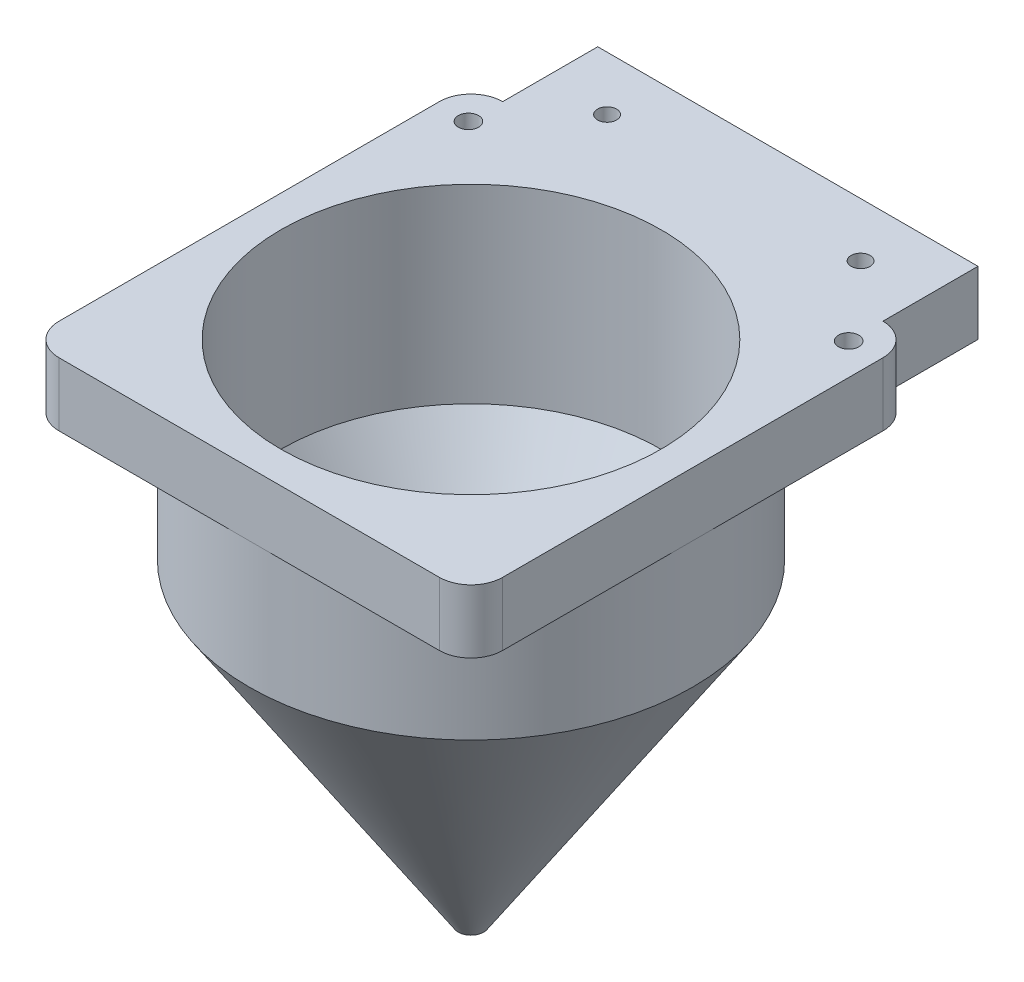
ISO-10303-21;
HEADER;
FILE_DESCRIPTION(('STEP AP214'),'2;1');
FILE_NAME('part.step','',(''),(''),'','','');
FILE_SCHEMA(('AUTOMOTIVE_DESIGN { 1 0 10303 214 1 1 1 1 }'));
ENDSEC;
DATA;
#1=APPLICATION_CONTEXT('core data for automotive mechanical design processes');
#2=APPLICATION_PROTOCOL_DEFINITION('international standard','automotive_design',2000,#1);
#3=PRODUCT_CONTEXT('',#1,'mechanical');
#4=PRODUCT('Part','Part','',(#3));
#5=PRODUCT_RELATED_PRODUCT_CATEGORY('part','',(#4));
#6=PRODUCT_DEFINITION_FORMATION('','',#4);
#7=PRODUCT_DEFINITION_CONTEXT('part definition',#1,'design');
#8=PRODUCT_DEFINITION('design','',#6,#7);
#9=PRODUCT_DEFINITION_SHAPE('','',#8);
#10=(LENGTH_UNIT() NAMED_UNIT(*) SI_UNIT(.MILLI.,.METRE.));
#11=(NAMED_UNIT(*) PLANE_ANGLE_UNIT() SI_UNIT($,.RADIAN.));
#12=(NAMED_UNIT(*) SI_UNIT($,.STERADIAN.) SOLID_ANGLE_UNIT());
#13=UNCERTAINTY_MEASURE_WITH_UNIT(LENGTH_MEASURE(1.E-05),#10,'distance_accuracy_value','');
#14=(GEOMETRIC_REPRESENTATION_CONTEXT(3) GLOBAL_UNCERTAINTY_ASSIGNED_CONTEXT((#13)) GLOBAL_UNIT_ASSIGNED_CONTEXT((#10,
#11,#12)) REPRESENTATION_CONTEXT('',''));
#15=CARTESIAN_POINT('',(0.,0.,0.));
#16=DIRECTION('',(0.,0.,1.));
#17=DIRECTION('',(1.,0.,0.));
#18=AXIS2_PLACEMENT_3D('',#15,#16,#17);
#19=CARTESIAN_POINT('',(35.,0.,0.));
#20=DIRECTION('',(1.,0.,0.));
#21=DIRECTION('',(0.,0.,-1.));
#22=AXIS2_PLACEMENT_3D('',#19,#20,#21);
#23=PLANE('',#22);
#24=DIRECTION('',(0.,0.,1.));
#25=VECTOR('',#24,1.);
#26=CARTESIAN_POINT('',(35.,30.,35.));
#27=LINE('',#26,#25);
#28=CARTESIAN_POINT('',(35.,30.,-30.));
#29=VERTEX_POINT('',#28);
#30=CARTESIAN_POINT('',(35.,30.,30.));
#31=VERTEX_POINT('',#30);
#32=EDGE_CURVE('E192',#29,#31,#27,.T.);
#33=ORIENTED_EDGE('',*,*,#32,.T.);
#34=DIRECTION('',(0.,-1.,0.));
#35=VECTOR('',#34,1.);
#36=CARTESIAN_POINT('',(35.,0.,30.));
#37=LINE('',#36,#35);
#38=CARTESIAN_POINT('',(35.,20.,30.));
#39=VERTEX_POINT('',#38);
#40=EDGE_CURVE('E235',#31,#39,#37,.T.);
#41=ORIENTED_EDGE('',*,*,#40,.T.);
#42=DIRECTION('',(0.,0.,-1.));
#43=VECTOR('',#42,1.);
#44=CARTESIAN_POINT('',(35.,20.,35.));
#45=LINE('',#44,#43);
#46=CARTESIAN_POINT('',(35.,20.,0.));
#47=VERTEX_POINT('',#46);
#48=EDGE_CURVE('E177',#39,#47,#45,.T.);
#49=ORIENTED_EDGE('',*,*,#48,.T.);
#50=DIRECTION('',(0.,0.,-1.));
#51=VECTOR('',#50,1.);
#52=CARTESIAN_POINT('',(35.,20.,35.));
#53=LINE('',#52,#51);
#54=CARTESIAN_POINT('',(35.,20.,-30.));
#55=VERTEX_POINT('',#54);
#56=EDGE_CURVE('E187',#47,#55,#53,.T.);
#57=ORIENTED_EDGE('',*,*,#56,.T.);
#58=DIRECTION('',(0.,1.,0.));
#59=VECTOR('',#58,1.);
#60=CARTESIAN_POINT('',(35.,0.,-30.));
#61=LINE('',#60,#59);
#62=EDGE_CURVE('E231',#55,#29,#61,.T.);
#63=ORIENTED_EDGE('',*,*,#62,.T.);
#64=EDGE_LOOP('',(#33,#41,#49,#57,#63));
#65=FACE_BOUND('',#64,.T.);
#66=ADVANCED_FACE('F45',(#65),#23,.T.);
#67=CARTESIAN_POINT('',(-35.001,20.,35.));
#68=DIRECTION('',(0.,-1.,0.));
#69=DIRECTION('',(0.,0.,-1.));
#70=AXIS2_PLACEMENT_3D('',#67,#68,#69);
#71=PLANE('',#70);
#72=CARTESIAN_POINT('',(-20.,20.,-41.4717846910839));
#73=DIRECTION('',(0.,-1.,0.));
#74=DIRECTION('',(0.,0.,-1.));
#75=AXIS2_PLACEMENT_3D('',#72,#73,#74);
#76=CIRCLE('',#75,1.5);
#77=CARTESIAN_POINT('',(-20.,20.,-42.9717846910839));
#78=VERTEX_POINT('',#77);
#79=EDGE_CURVE('E142',#78,#78,#76,.T.);
#80=ORIENTED_EDGE('',*,*,#79,.F.);
#81=EDGE_LOOP('',(#80));
#82=FACE_BOUND('',#81,.T.);
#83=CARTESIAN_POINT('',(20.,20.,-41.4717846910839));
#84=DIRECTION('',(0.,-1.,0.));
#85=DIRECTION('',(0.,0.,-1.));
#86=AXIS2_PLACEMENT_3D('',#83,#84,#85);
#87=CIRCLE('',#86,1.5);
#88=CARTESIAN_POINT('',(20.,20.,-42.9717846910839));
#89=VERTEX_POINT('',#88);
#90=EDGE_CURVE('E333',#89,#89,#87,.T.);
#91=ORIENTED_EDGE('',*,*,#90,.F.);
#92=EDGE_LOOP('',(#91));
#93=FACE_BOUND('',#92,.T.);
#94=CARTESIAN_POINT('',(30.,20.,-29.5959027597665));
#95=DIRECTION('',(0.,-1.,0.));
#96=DIRECTION('',(0.,0.,-1.));
#97=AXIS2_PLACEMENT_3D('',#94,#95,#96);
#98=CIRCLE('',#97,1.6);
#99=CARTESIAN_POINT('',(30.,20.,-31.1959027597665));
#100=VERTEX_POINT('',#99);
#101=EDGE_CURVE('E172',#100,#100,#98,.T.);
#102=ORIENTED_EDGE('',*,*,#101,.F.);
#103=EDGE_LOOP('',(#102));
#104=FACE_BOUND('',#103,.T.);
#105=CARTESIAN_POINT('',(0.,20.,0.));
#106=DIRECTION('',(0.,-1.,0.));
#107=DIRECTION('',(0.,0.,-1.));
#108=AXIS2_PLACEMENT_3D('',#105,#106,#107);
#109=CIRCLE('',#108,35.);
#110=CARTESIAN_POINT('',(-35.,20.,0.));
#111=VERTEX_POINT('',#110);
#112=EDGE_CURVE('E188',#47,#111,#109,.F.);
#113=ORIENTED_EDGE('',*,*,#112,.T.);
#114=DIRECTION('',(0.,0.,-1.));
#115=VECTOR('',#114,1.);
#116=CARTESIAN_POINT('',(-35.,20.,35.));
#117=LINE('',#116,#115);
#118=CARTESIAN_POINT('',(-35.,20.,-30.));
#119=VERTEX_POINT('',#118);
#120=EDGE_CURVE('E137',#111,#119,#117,.T.);
#121=ORIENTED_EDGE('',*,*,#120,.T.);
#122=CARTESIAN_POINT('',(-30.,20.,-30.));
#123=DIRECTION('',(0.,1.,0.));
#124=DIRECTION('',(0.,0.,1.));
#125=AXIS2_PLACEMENT_3D('',#122,#123,#124);
#126=CIRCLE('',#125,5.);
#127=CARTESIAN_POINT('',(-30.,20.,-35.));
#128=VERTEX_POINT('',#127);
#129=EDGE_CURVE('E129',#119,#128,#126,.F.);
#130=ORIENTED_EDGE('',*,*,#129,.T.);
#131=DIRECTION('',(0.,0.,1.));
#132=VECTOR('',#131,1.);
#133=CARTESIAN_POINT('',(-30.,20.,-50.));
#134=LINE('',#133,#132);
#135=CARTESIAN_POINT('',(-30.,20.,-50.));
#136=VERTEX_POINT('',#135);
#137=EDGE_CURVE('E134',#136,#128,#134,.T.);
#138=ORIENTED_EDGE('',*,*,#137,.F.);
#139=DIRECTION('',(-1.,0.,0.));
#140=VECTOR('',#139,1.);
#141=CARTESIAN_POINT('',(30.,20.,-50.));
#142=LINE('',#141,#140);
#143=CARTESIAN_POINT('',(30.,20.,-50.));
#144=VERTEX_POINT('',#143);
#145=EDGE_CURVE('E303',#144,#136,#142,.T.);
#146=ORIENTED_EDGE('',*,*,#145,.F.);
#147=DIRECTION('',(0.,0.,1.));
#148=VECTOR('',#147,1.);
#149=CARTESIAN_POINT('',(30.,20.,-50.));
#150=LINE('',#149,#148);
#151=CARTESIAN_POINT('',(30.,20.,-35.));
#152=VERTEX_POINT('',#151);
#153=EDGE_CURVE('E158',#144,#152,#150,.T.);
#154=ORIENTED_EDGE('',*,*,#153,.T.);
#155=CARTESIAN_POINT('',(30.,20.,-30.));
#156=DIRECTION('',(0.,-1.,0.));
#157=DIRECTION('',(0.,0.,-1.));
#158=AXIS2_PLACEMENT_3D('',#155,#156,#157);
#159=CIRCLE('',#158,5.);
#160=EDGE_CURVE('E12',#152,#55,#159,.T.);
#161=ORIENTED_EDGE('',*,*,#160,.T.);
#162=ORIENTED_EDGE('',*,*,#56,.F.);
#163=EDGE_LOOP('',(#113,#121,#130,#138,#146,#154,#161,#162));
#164=FACE_BOUND('',#163,.T.);
#165=CARTESIAN_POINT('',(-30.,20.,-29.5959027597665));
#166=DIRECTION('',(0.,1.,0.));
#167=DIRECTION('',(0.,0.,1.));
#168=AXIS2_PLACEMENT_3D('',#165,#166,#167);
#169=CIRCLE('',#168,1.6);
#170=CARTESIAN_POINT('',(-30.,20.,-27.9959027597665));
#171=VERTEX_POINT('',#170);
#172=EDGE_CURVE('E296',#171,#171,#169,.T.);
#173=ORIENTED_EDGE('',*,*,#172,.T.);
#174=EDGE_LOOP('',(#173));
#175=FACE_BOUND('',#174,.T.);
#176=ADVANCED_FACE('F131',(#82,#93,#104,#164,#175),#71,.T.);
#177=CARTESIAN_POINT('',(30.,0.,-30.));
#178=DIRECTION('',(0.,1.,0.));
#179=DIRECTION('',(0.,0.,1.));
#180=AXIS2_PLACEMENT_3D('',#177,#178,#179);
#181=CYLINDRICAL_SURFACE('',#180,5.);
#182=ORIENTED_EDGE('',*,*,#160,.F.);
#183=DIRECTION('',(0.,1.,0.));
#184=VECTOR('',#183,1.);
#185=CARTESIAN_POINT('',(30.,30.,-35.));
#186=LINE('',#185,#184);
#187=CARTESIAN_POINT('',(30.,30.,-35.));
#188=VERTEX_POINT('',#187);
#189=EDGE_CURVE('E54',#188,#152,#186,.F.);
#190=ORIENTED_EDGE('',*,*,#189,.F.);
#191=CARTESIAN_POINT('',(30.,30.,-30.));
#192=DIRECTION('',(0.,1.,0.));
#193=DIRECTION('',(0.,0.,1.));
#194=AXIS2_PLACEMENT_3D('',#191,#192,#193);
#195=CIRCLE('',#194,5.);
#196=EDGE_CURVE('E224',#29,#188,#195,.T.);
#197=ORIENTED_EDGE('',*,*,#196,.F.);
#198=ORIENTED_EDGE('',*,*,#62,.F.);
#199=EDGE_LOOP('',(#182,#190,#197,#198));
#200=FACE_BOUND('',#199,.T.);
#201=ADVANCED_FACE('F47',(#200),#181,.T.);
#202=CARTESIAN_POINT('',(-35.001,20.,35.));
#203=DIRECTION('',(0.,-1.,0.));
#204=DIRECTION('',(0.,0.,-1.));
#205=AXIS2_PLACEMENT_3D('',#202,#203,#204);
#206=PLANE('',#205);
#207=ORIENTED_EDGE('',*,*,#48,.F.);
#208=CARTESIAN_POINT('',(30.,20.,30.));
#209=DIRECTION('',(0.,-1.,0.));
#210=DIRECTION('',(0.,0.,-1.));
#211=AXIS2_PLACEMENT_3D('',#208,#209,#210);
#212=CIRCLE('',#211,5.);
#213=CARTESIAN_POINT('',(30.,20.,35.));
#214=VERTEX_POINT('',#213);
#215=EDGE_CURVE('E239',#39,#214,#212,.T.);
#216=ORIENTED_EDGE('',*,*,#215,.T.);
#217=DIRECTION('',(1.,0.,0.));
#218=VECTOR('',#217,1.);
#219=CARTESIAN_POINT('',(-35.001,20.,35.));
#220=LINE('',#219,#218);
#221=CARTESIAN_POINT('',(0.,20.,35.));
#222=VERTEX_POINT('',#221);
#223=EDGE_CURVE('E181',#222,#214,#220,.T.);
#224=ORIENTED_EDGE('',*,*,#223,.F.);
#225=CARTESIAN_POINT('',(0.,20.,0.));
#226=DIRECTION('',(0.,-1.,0.));
#227=DIRECTION('',(0.,0.,-1.));
#228=AXIS2_PLACEMENT_3D('',#225,#226,#227);
#229=CIRCLE('',#228,35.);
#230=EDGE_CURVE('E173',#222,#47,#229,.F.);
#231=ORIENTED_EDGE('',*,*,#230,.T.);
#232=EDGE_LOOP('',(#207,#216,#224,#231));
#233=FACE_BOUND('',#232,.T.);
#234=ADVANCED_FACE('F264',(#233),#206,.T.);
#235=CARTESIAN_POINT('',(-35.001,30.,35.));
#236=DIRECTION('',(0.,0.,1.));
#237=DIRECTION('',(1.,0.,0.));
#238=AXIS2_PLACEMENT_3D('',#235,#236,#237);
#239=PLANE('',#238);
#240=DIRECTION('',(1.,0.,0.));
#241=VECTOR('',#240,1.);
#242=CARTESIAN_POINT('',(-35.001,30.,35.));
#243=LINE('',#242,#241);
#244=CARTESIAN_POINT('',(-30.,30.,35.));
#245=VERTEX_POINT('',#244);
#246=CARTESIAN_POINT('',(30.,30.,35.));
#247=VERTEX_POINT('',#246);
#248=EDGE_CURVE('E178',#245,#247,#243,.T.);
#249=ORIENTED_EDGE('',*,*,#248,.F.);
#250=DIRECTION('',(0.,-1.,0.));
#251=VECTOR('',#250,1.);
#252=CARTESIAN_POINT('',(-30.,30.,35.));
#253=LINE('',#252,#251);
#254=CARTESIAN_POINT('',(-30.,20.,35.));
#255=VERTEX_POINT('',#254);
#256=EDGE_CURVE('E273',#245,#255,#253,.T.);
#257=ORIENTED_EDGE('',*,*,#256,.T.);
#258=DIRECTION('',(-1.,0.,0.));
#259=VECTOR('',#258,1.);
#260=CARTESIAN_POINT('',(35.001,20.,35.));
#261=LINE('',#260,#259);
#262=EDGE_CURVE('E270',#222,#255,#261,.T.);
#263=ORIENTED_EDGE('',*,*,#262,.F.);
#264=ORIENTED_EDGE('',*,*,#223,.T.);
#265=DIRECTION('',(0.,-1.,0.));
#266=VECTOR('',#265,1.);
#267=CARTESIAN_POINT('',(30.,30.,35.));
#268=LINE('',#267,#266);
#269=EDGE_CURVE('E214',#214,#247,#268,.F.);
#270=ORIENTED_EDGE('',*,*,#269,.T.);
#271=EDGE_LOOP('',(#249,#257,#263,#264,#270));
#272=FACE_BOUND('',#271,.T.);
#273=ADVANCED_FACE('F267',(#272),#239,.T.);
#274=CARTESIAN_POINT('',(30.,0.,30.));
#275=DIRECTION('',(0.,-1.,0.));
#276=DIRECTION('',(0.,0.,-1.));
#277=AXIS2_PLACEMENT_3D('',#274,#275,#276);
#278=CYLINDRICAL_SURFACE('',#277,5.);
#279=CARTESIAN_POINT('',(30.,30.,30.));
#280=DIRECTION('',(0.,1.,0.));
#281=DIRECTION('',(0.,0.,1.));
#282=AXIS2_PLACEMENT_3D('',#279,#280,#281);
#283=CIRCLE('',#282,5.);
#284=EDGE_CURVE('E228',#247,#31,#283,.T.);
#285=ORIENTED_EDGE('',*,*,#284,.F.);
#286=ORIENTED_EDGE('',*,*,#269,.F.);
#287=ORIENTED_EDGE('',*,*,#215,.F.);
#288=ORIENTED_EDGE('',*,*,#40,.F.);
#289=EDGE_LOOP('',(#285,#286,#287,#288));
#290=FACE_BOUND('',#289,.T.);
#291=ADVANCED_FACE('F260',(#290),#278,.T.);
#292=CARTESIAN_POINT('',(30.,-50.,-29.5959027597665));
#293=DIRECTION('',(0.,1.,0.));
#294=DIRECTION('',(0.,0.,1.));
#295=AXIS2_PLACEMENT_3D('',#292,#293,#294);
#296=CYLINDRICAL_SURFACE('',#295,1.6);
#297=ORIENTED_EDGE('',*,*,#101,.T.);
#298=EDGE_LOOP('',(#297));
#299=FACE_BOUND('',#298,.T.);
#300=CARTESIAN_POINT('',(30.,30.,-29.5959027597665));
#301=DIRECTION('',(0.,1.,0.));
#302=DIRECTION('',(0.,0.,1.));
#303=AXIS2_PLACEMENT_3D('',#300,#301,#302);
#304=CIRCLE('',#303,1.6);
#305=CARTESIAN_POINT('',(30.,30.,-27.9959027597665));
#306=VERTEX_POINT('',#305);
#307=EDGE_CURVE('E163',#306,#306,#304,.T.);
#308=ORIENTED_EDGE('',*,*,#307,.T.);
#309=EDGE_LOOP('',(#308));
#310=FACE_BOUND('',#309,.T.);
#311=ADVANCED_FACE('F393',(#299,#310),#296,.F.);
#312=CARTESIAN_POINT('',(0.,30.,0.));
#313=DIRECTION('',(0.,-1.,0.));
#314=DIRECTION('',(0.,0.,-1.));
#315=AXIS2_PLACEMENT_3D('',#312,#313,#314);
#316=CYLINDRICAL_SURFACE('',#315,35.);
#317=CARTESIAN_POINT('',(0.,0.,0.));
#318=DIRECTION('',(0.,1.,0.));
#319=DIRECTION('',(-1.,0.,0.));
#320=AXIS2_PLACEMENT_3D('',#317,#318,#319);
#321=CIRCLE('',#320,35.);
#322=CARTESIAN_POINT('',(-35.,0.,0.));
#323=VERTEX_POINT('',#322);
#324=EDGE_CURVE('E201',#323,#323,#321,.T.);
#325=ORIENTED_EDGE('',*,*,#324,.T.);
#326=EDGE_LOOP('',(#325));
#327=FACE_BOUND('',#326,.T.);
#328=ORIENTED_EDGE('',*,*,#230,.F.);
#329=CARTESIAN_POINT('',(0.,20.,0.));
#330=DIRECTION('',(0.,1.,0.));
#331=DIRECTION('',(0.,0.,1.));
#332=AXIS2_PLACEMENT_3D('',#329,#330,#331);
#333=CIRCLE('',#332,35.);
#334=EDGE_CURVE('E277',#222,#111,#333,.F.);
#335=ORIENTED_EDGE('',*,*,#334,.T.);
#336=ORIENTED_EDGE('',*,*,#112,.F.);
#337=EDGE_LOOP('',(#328,#335,#336));
#338=FACE_BOUND('',#337,.T.);
#339=ADVANCED_FACE('F379',(#327,#338),#316,.T.);
#340=CARTESIAN_POINT('',(2.00000000000001,-50.,0.));
#341=DIRECTION('',(0.,1.,0.));
#342=DIRECTION('',(-1.,0.,0.));
#343=AXIS2_PLACEMENT_3D('',#340,#341,#342);
#344=PLANE('',#343);
#345=CARTESIAN_POINT('',(0.,-50.,0.));
#346=DIRECTION('',(0.,1.,0.));
#347=DIRECTION('',(-1.,0.,0.));
#348=AXIS2_PLACEMENT_3D('',#345,#346,#347);
#349=CIRCLE('',#348,2.);
#350=CARTESIAN_POINT('',(-1.99999999999999,-50.,0.));
#351=VERTEX_POINT('',#350);
#352=EDGE_CURVE('E191',#351,#351,#349,.T.);
#353=ORIENTED_EDGE('',*,*,#352,.F.);
#354=EDGE_LOOP('',(#353));
#355=FACE_BOUND('',#354,.T.);
#356=ADVANCED_FACE('F373',(#355),#344,.F.);
#357=CARTESIAN_POINT('',(0.,-50.,0.));
#358=DIRECTION('',(0.,1.,0.));
#359=DIRECTION('',(-1.,0.,0.));
#360=AXIS2_PLACEMENT_3D('',#357,#358,#359);
#361=CONICAL_SURFACE('',#360,2.,0.583373006993856);
#362=CARTESIAN_POINT('',(-35.,0.,0.));
#363=CARTESIAN_POINT('',(-34.65625,-0.520833333333342,0.));
#364=CARTESIAN_POINT('',(-34.3125,-1.04166666666668,0.));
#365=CARTESIAN_POINT('',(-33.625,-2.08333333333334,0.));
#366=CARTESIAN_POINT('',(-33.28125,-2.60416666666668,0.));
#367=CARTESIAN_POINT('',(-32.59375,-3.64583333333334,0.));
#368=CARTESIAN_POINT('',(-32.25,-4.16666666666667,0.));
#369=CARTESIAN_POINT('',(-31.5625,-5.20833333333334,0.));
#370=CARTESIAN_POINT('',(-31.21875,-5.72916666666667,0.));
#371=CARTESIAN_POINT('',(-30.53125,-6.77083333333334,0.));
#372=CARTESIAN_POINT('',(-30.1875,-7.29166666666667,0.));
#373=CARTESIAN_POINT('',(-29.5,-8.33333333333334,0.));
#374=CARTESIAN_POINT('',(-29.15625,-8.85416666666667,0.));
#375=CARTESIAN_POINT('',(-28.46875,-9.89583333333334,0.));
#376=CARTESIAN_POINT('',(-28.125,-10.4166666666667,0.));
#377=CARTESIAN_POINT('',(-27.4375,-11.4583333333333,0.));
#378=CARTESIAN_POINT('',(-27.09375,-11.9791666666667,0.));
#379=CARTESIAN_POINT('',(-26.40625,-13.0208333333333,0.));
#380=CARTESIAN_POINT('',(-26.0625,-13.5416666666667,0.));
#381=CARTESIAN_POINT('',(-25.375,-14.5833333333333,0.));
#382=CARTESIAN_POINT('',(-25.03125,-15.1041666666667,0.));
#383=CARTESIAN_POINT('',(-24.34375,-16.1458333333333,0.));
#384=CARTESIAN_POINT('',(-24.,-16.6666666666667,0.));
#385=CARTESIAN_POINT('',(-23.3125,-17.7083333333333,0.));
#386=CARTESIAN_POINT('',(-22.96875,-18.2291666666667,0.));
#387=CARTESIAN_POINT('',(-22.28125,-19.2708333333333,0.));
#388=CARTESIAN_POINT('',(-21.9375,-19.7916666666667,0.));
#389=CARTESIAN_POINT('',(-21.25,-20.8333333333333,0.));
#390=CARTESIAN_POINT('',(-20.90625,-21.3541666666667,0.));
#391=CARTESIAN_POINT('',(-20.21875,-22.3958333333333,0.));
#392=CARTESIAN_POINT('',(-19.875,-22.9166666666667,0.));
#393=CARTESIAN_POINT('',(-19.1875,-23.9583333333333,0.));
#394=CARTESIAN_POINT('',(-18.84375,-24.4791666666667,0.));
#395=CARTESIAN_POINT('',(-18.15625,-25.5208333333333,0.));
#396=CARTESIAN_POINT('',(-17.8125,-26.0416666666667,0.));
#397=CARTESIAN_POINT('',(-17.125,-27.0833333333333,0.));
#398=CARTESIAN_POINT('',(-16.78125,-27.6041666666667,0.));
#399=CARTESIAN_POINT('',(-16.09375,-28.6458333333333,0.));
#400=CARTESIAN_POINT('',(-15.75,-29.1666666666667,0.));
#401=CARTESIAN_POINT('',(-15.0625,-30.2083333333333,0.));
#402=CARTESIAN_POINT('',(-14.71875,-30.7291666666667,0.));
#403=CARTESIAN_POINT('',(-14.03125,-31.7708333333333,0.));
#404=CARTESIAN_POINT('',(-13.6875,-32.2916666666667,0.));
#405=CARTESIAN_POINT('',(-13.,-33.3333333333333,0.));
#406=CARTESIAN_POINT('',(-12.65625,-33.8541666666667,0.));
#407=CARTESIAN_POINT('',(-11.96875,-34.8958333333333,0.));
#408=CARTESIAN_POINT('',(-11.625,-35.4166666666667,0.));
#409=CARTESIAN_POINT('',(-10.9375,-36.4583333333333,0.));
#410=CARTESIAN_POINT('',(-10.59375,-36.9791666666667,0.));
#411=CARTESIAN_POINT('',(-9.90624999999999,-38.0208333333333,0.));
#412=CARTESIAN_POINT('',(-9.56249999999999,-38.5416666666667,0.));
#413=CARTESIAN_POINT('',(-8.875,-39.5833333333333,0.));
#414=CARTESIAN_POINT('',(-8.53124999999999,-40.1041666666667,0.));
#415=CARTESIAN_POINT('',(-7.84374999999999,-41.1458333333333,0.));
#416=CARTESIAN_POINT('',(-7.49999999999999,-41.6666666666667,0.));
#417=CARTESIAN_POINT('',(-6.81249999999999,-42.7083333333333,0.));
#418=CARTESIAN_POINT('',(-6.46874999999999,-43.2291666666667,0.));
#419=CARTESIAN_POINT('',(-5.78124999999999,-44.2708333333333,0.));
#420=CARTESIAN_POINT('',(-5.43749999999999,-44.7916666666667,0.));
#421=CARTESIAN_POINT('',(-4.74999999999999,-45.8333333333333,0.));
#422=CARTESIAN_POINT('',(-4.40624999999999,-46.3541666666667,0.));
#423=CARTESIAN_POINT('',(-3.71874999999999,-47.3958333333333,0.));
#424=CARTESIAN_POINT('',(-3.37499999999999,-47.9166666666667,0.));
#425=CARTESIAN_POINT('',(-2.68749999999999,-48.9583333333333,0.));
#426=CARTESIAN_POINT('',(-2.34374999999999,-49.4791666666667,0.));
#427=CARTESIAN_POINT('',(-1.99999999999999,-50.,0.));
#428=B_SPLINE_CURVE_WITH_KNOTS('',3,(#362,#363,#364,#365,#366,#367,#368,#369,#370,#371,#372,
#373,#374,#375,#376,#377,#378,#379,#380,#381,#382,#383,#384,#385,#386,#387,#388,#389,#390,#391,
#392,#393,#394,#395,#396,#397,#398,#399,#400,#401,#402,#403,#404,#405,#406,#407,#408,#409,#410,
#411,#412,#413,#414,#415,#416,#417,#418,#419,#420,#421,#422,#423,#424,#425,#426,#427),
.UNSPECIFIED.,.F.,.F.,(4,2,2,2,2,2,2,2,2,2,2,2,2,2,2,2,2,2,2,2,2,2,2,2,2,2,2,2,2,2,2,2,4),(0.,
1.87213322509377,3.74426645018754,5.61639967528131,7.48853290037508,9.36066612546885,
11.2327993505626,13.1049325756564,14.9770658007502,16.8491990258439,18.7213322509377,
20.5934654760315,22.4655987011252,24.337731926219,26.2098651513128,28.0819983764065,
29.9541316015003,31.8262648265941,33.6983980516879,35.5705312767816,37.4426645018754,
39.3147977269692,41.1869309520629,43.0590641771567,44.9311974022505,46.8033306273443,
48.675463852438,50.5475970775318,52.4197303026256,54.2918635277193,56.1639967528131,
58.0361299779069,59.9082632030007),.UNSPECIFIED.);
#429=EDGE_CURVE('BSEAM351',#323,#351,#428,.T.);
#430=ORIENTED_EDGE('',*,*,#324,.F.);
#431=ORIENTED_EDGE('',*,*,#352,.T.);
#432=ORIENTED_EDGE('',*,*,#429,.T.);
#433=ORIENTED_EDGE('',*,*,#429,.F.);
#434=EDGE_LOOP('',(#430,#432,#431,#433));
#435=FACE_BOUND('',#434,.T.);
#436=ADVANCED_FACE('F351',(#435),#361,.T.);
#437=CARTESIAN_POINT('',(0.,30.,0.));
#438=DIRECTION('',(0.,1.,0.));
#439=DIRECTION('',(0.,0.,1.));
#440=AXIS2_PLACEMENT_3D('',#437,#438,#439);
#441=PLANE('',#440);
#442=CARTESIAN_POINT('',(-20.,30.,-41.4717846910839));
#443=DIRECTION('',(0.,1.,0.));
#444=DIRECTION('',(0.,0.,1.));
#445=AXIS2_PLACEMENT_3D('',#442,#443,#444);
#446=CIRCLE('',#445,1.5);
#447=CARTESIAN_POINT('',(-20.,30.,-39.9717846910839));
#448=VERTEX_POINT('',#447);
#449=EDGE_CURVE('E337',#448,#448,#446,.T.);
#450=ORIENTED_EDGE('',*,*,#449,.F.);
#451=EDGE_LOOP('',(#450));
#452=FACE_BOUND('',#451,.T.);
#453=CARTESIAN_POINT('',(20.,30.,-41.4717846910839));
#454=DIRECTION('',(0.,1.,0.));
#455=DIRECTION('',(0.,0.,1.));
#456=AXIS2_PLACEMENT_3D('',#453,#454,#455);
#457=CIRCLE('',#456,1.5);
#458=CARTESIAN_POINT('',(20.,30.,-39.9717846910839));
#459=VERTEX_POINT('',#458);
#460=EDGE_CURVE('E338',#459,#459,#457,.T.);
#461=ORIENTED_EDGE('',*,*,#460,.F.);
#462=EDGE_LOOP('',(#461));
#463=FACE_BOUND('',#462,.T.);
#464=CARTESIAN_POINT('',(0.,30.,0.));
#465=DIRECTION('',(0.,1.,0.));
#466=DIRECTION('',(0.,0.,1.));
#467=AXIS2_PLACEMENT_3D('',#464,#465,#466);
#468=CIRCLE('',#467,30.);
#469=CARTESIAN_POINT('',(0.,30.,30.));
#470=VERTEX_POINT('',#469);
#471=EDGE_CURVE('E210',#470,#470,#468,.T.);
#472=ORIENTED_EDGE('',*,*,#471,.F.);
#473=EDGE_LOOP('',(#472));
#474=FACE_BOUND('',#473,.T.);
#475=CARTESIAN_POINT('',(-30.,30.,30.));
#476=DIRECTION('',(0.,1.,0.));
#477=DIRECTION('',(0.,0.,1.));
#478=AXIS2_PLACEMENT_3D('',#475,#476,#477);
#479=CIRCLE('',#478,5.);
#480=CARTESIAN_POINT('',(-35.,30.,30.));
#481=VERTEX_POINT('',#480);
#482=EDGE_CURVE('E141',#481,#245,#479,.T.);
#483=ORIENTED_EDGE('',*,*,#482,.T.);
#484=ORIENTED_EDGE('',*,*,#248,.T.);
#485=ORIENTED_EDGE('',*,*,#284,.T.);
#486=ORIENTED_EDGE('',*,*,#32,.F.);
#487=ORIENTED_EDGE('',*,*,#196,.T.);
#488=DIRECTION('',(0.,0.,1.));
#489=VECTOR('',#488,1.);
#490=CARTESIAN_POINT('',(30.,30.,-50.));
#491=LINE('',#490,#489);
#492=CARTESIAN_POINT('',(30.,30.,-50.));
#493=VERTEX_POINT('',#492);
#494=EDGE_CURVE('E165',#493,#188,#491,.T.);
#495=ORIENTED_EDGE('',*,*,#494,.F.);
#496=DIRECTION('',(1.,0.,0.));
#497=VECTOR('',#496,1.);
#498=CARTESIAN_POINT('',(30.,30.,-50.));
#499=LINE('',#498,#497);
#500=CARTESIAN_POINT('',(-30.,30.,-50.));
#501=VERTEX_POINT('',#500);
#502=EDGE_CURVE('E308',#501,#493,#499,.T.);
#503=ORIENTED_EDGE('',*,*,#502,.F.);
#504=DIRECTION('',(0.,0.,1.));
#505=VECTOR('',#504,1.);
#506=CARTESIAN_POINT('',(-30.,30.,-50.));
#507=LINE('',#506,#505);
#508=CARTESIAN_POINT('',(-30.,30.,-35.));
#509=VERTEX_POINT('',#508);
#510=EDGE_CURVE('E159',#501,#509,#507,.T.);
#511=ORIENTED_EDGE('',*,*,#510,.T.);
#512=CARTESIAN_POINT('',(-30.,30.,-30.));
#513=DIRECTION('',(0.,1.,0.));
#514=DIRECTION('',(0.,0.,1.));
#515=AXIS2_PLACEMENT_3D('',#512,#513,#514);
#516=CIRCLE('',#515,5.);
#517=CARTESIAN_POINT('',(-35.,30.,-30.));
#518=VERTEX_POINT('',#517);
#519=EDGE_CURVE('E147',#509,#518,#516,.T.);
#520=ORIENTED_EDGE('',*,*,#519,.T.);
#521=DIRECTION('',(0.,0.,1.));
#522=VECTOR('',#521,1.);
#523=CARTESIAN_POINT('',(-35.,30.,35.));
#524=LINE('',#523,#522);
#525=EDGE_CURVE('E292',#518,#481,#524,.T.);
#526=ORIENTED_EDGE('',*,*,#525,.T.);
#527=EDGE_LOOP('',(#483,#484,#485,#486,#487,#495,#503,#511,#520,#526));
#528=FACE_BOUND('',#527,.T.);
#529=ORIENTED_EDGE('',*,*,#307,.F.);
#530=EDGE_LOOP('',(#529));
#531=FACE_BOUND('',#530,.T.);
#532=CARTESIAN_POINT('',(-30.,30.,-29.5959027597665));
#533=DIRECTION('',(0.,1.,0.));
#534=DIRECTION('',(0.,0.,1.));
#535=AXIS2_PLACEMENT_3D('',#532,#533,#534);
#536=CIRCLE('',#535,1.6);
#537=CARTESIAN_POINT('',(-30.,30.,-27.9959027597665));
#538=VERTEX_POINT('',#537);
#539=EDGE_CURVE('E153',#538,#538,#536,.T.);
#540=ORIENTED_EDGE('',*,*,#539,.F.);
#541=EDGE_LOOP('',(#540));
#542=FACE_BOUND('',#541,.T.);
#543=ADVANCED_FACE('F252',(#452,#463,#474,#528,#531,#542),#441,.T.);
#544=CARTESIAN_POINT('',(0.,-45.,0.));
#545=DIRECTION('',(0.,-1.,0.));
#546=DIRECTION('',(1.,0.,0.));
#547=AXIS2_PLACEMENT_3D('',#544,#545,#546);
#548=PLANE('',#547);
#549=CARTESIAN_POINT('',(0.,-45.,0.));
#550=DIRECTION('',(0.,1.,0.));
#551=DIRECTION('',(-1.,0.,0.));
#552=AXIS2_PLACEMENT_3D('',#549,#550,#551);
#553=CIRCLE('',#552,2.);
#554=CARTESIAN_POINT('',(-1.99999999999999,-45.,0.));
#555=VERTEX_POINT('',#554);
#556=EDGE_CURVE('E205',#555,#555,#553,.T.);
#557=ORIENTED_EDGE('',*,*,#556,.T.);
#558=EDGE_LOOP('',(#557));
#559=FACE_BOUND('',#558,.T.);
#560=ADVANCED_FACE('F350',(#559),#548,.F.);
#561=CARTESIAN_POINT('',(0.,30.,0.));
#562=DIRECTION('',(0.,-1.,0.));
#563=DIRECTION('',(0.,0.,-1.));
#564=AXIS2_PLACEMENT_3D('',#561,#562,#563);
#565=CYLINDRICAL_SURFACE('',#564,30.);
#566=CARTESIAN_POINT('',(0.,0.,0.));
#567=DIRECTION('',(0.,1.,0.));
#568=DIRECTION('',(0.,0.,1.));
#569=AXIS2_PLACEMENT_3D('',#566,#567,#568);
#570=CIRCLE('',#569,30.);
#571=CARTESIAN_POINT('',(-30.,0.,0.));
#572=VERTEX_POINT('',#571);
#573=EDGE_CURVE('E209',#572,#572,#570,.T.);
#574=ORIENTED_EDGE('',*,*,#573,.F.);
#575=EDGE_LOOP('',(#574));
#576=FACE_BOUND('',#575,.T.);
#577=ORIENTED_EDGE('',*,*,#471,.T.);
#578=EDGE_LOOP('',(#577));
#579=FACE_BOUND('',#578,.T.);
#580=ADVANCED_FACE('F358',(#576,#579),#565,.F.);
#581=CARTESIAN_POINT('',(0.,0.,0.));
#582=DIRECTION('',(0.,1.,0.));
#583=DIRECTION('',(-1.,0.,0.));
#584=AXIS2_PLACEMENT_3D('',#581,#582,#583);
#585=CONICAL_SURFACE('',#584,30.,0.556599318010223);
#586=CARTESIAN_POINT('',(-1.99999999999999,-45.,0.));
#587=CARTESIAN_POINT('',(-2.29166666666666,-44.53125,0.));
#588=CARTESIAN_POINT('',(-2.58333333333332,-44.0625,0.));
#589=CARTESIAN_POINT('',(-3.16666666666666,-43.125,0.));
#590=CARTESIAN_POINT('',(-3.45833333333332,-42.65625,0.));
#591=CARTESIAN_POINT('',(-4.04166666666666,-41.71875,0.));
#592=CARTESIAN_POINT('',(-4.33333333333333,-41.25,0.));
#593=CARTESIAN_POINT('',(-4.91666666666666,-40.3125,0.));
#594=CARTESIAN_POINT('',(-5.20833333333332,-39.84375,0.));
#595=CARTESIAN_POINT('',(-5.79166666666666,-38.90625,0.));
#596=CARTESIAN_POINT('',(-6.08333333333333,-38.4375,0.));
#597=CARTESIAN_POINT('',(-6.66666666666666,-37.5,0.));
#598=CARTESIAN_POINT('',(-6.95833333333333,-37.03125,0.));
#599=CARTESIAN_POINT('',(-7.54166666666666,-36.09375,0.));
#600=CARTESIAN_POINT('',(-7.83333333333333,-35.625,0.));
#601=CARTESIAN_POINT('',(-8.41666666666666,-34.6875,0.));
#602=CARTESIAN_POINT('',(-8.70833333333333,-34.21875,0.));
#603=CARTESIAN_POINT('',(-9.29166666666666,-33.28125,0.));
#604=CARTESIAN_POINT('',(-9.58333333333333,-32.8125,0.));
#605=CARTESIAN_POINT('',(-10.1666666666667,-31.875,0.));
#606=CARTESIAN_POINT('',(-10.4583333333333,-31.40625,0.));
#607=CARTESIAN_POINT('',(-11.0416666666667,-30.46875,0.));
#608=CARTESIAN_POINT('',(-11.3333333333333,-30.,0.));
#609=CARTESIAN_POINT('',(-11.9166666666667,-29.0625,0.));
#610=CARTESIAN_POINT('',(-12.2083333333333,-28.59375,0.));
#611=CARTESIAN_POINT('',(-12.7916666666667,-27.65625,0.));
#612=CARTESIAN_POINT('',(-13.0833333333333,-27.1875,0.));
#613=CARTESIAN_POINT('',(-13.6666666666667,-26.25,0.));
#614=CARTESIAN_POINT('',(-13.9583333333333,-25.78125,0.));
#615=CARTESIAN_POINT('',(-14.5416666666667,-24.84375,0.));
#616=CARTESIAN_POINT('',(-14.8333333333333,-24.375,0.));
#617=CARTESIAN_POINT('',(-15.4166666666667,-23.4375,0.));
#618=CARTESIAN_POINT('',(-15.7083333333333,-22.96875,0.));
#619=CARTESIAN_POINT('',(-16.2916666666667,-22.03125,0.));
#620=CARTESIAN_POINT('',(-16.5833333333333,-21.5625,0.));
#621=CARTESIAN_POINT('',(-17.1666666666667,-20.625,0.));
#622=CARTESIAN_POINT('',(-17.4583333333333,-20.15625,0.));
#623=CARTESIAN_POINT('',(-18.0416666666667,-19.21875,0.));
#624=CARTESIAN_POINT('',(-18.3333333333333,-18.75,0.));
#625=CARTESIAN_POINT('',(-18.9166666666667,-17.8125,0.));
#626=CARTESIAN_POINT('',(-19.2083333333333,-17.34375,0.));
#627=CARTESIAN_POINT('',(-19.7916666666667,-16.40625,0.));
#628=CARTESIAN_POINT('',(-20.0833333333333,-15.9375,0.));
#629=CARTESIAN_POINT('',(-20.6666666666667,-15.,0.));
#630=CARTESIAN_POINT('',(-20.9583333333333,-14.53125,0.));
#631=CARTESIAN_POINT('',(-21.5416666666667,-13.59375,0.));
#632=CARTESIAN_POINT('',(-21.8333333333333,-13.125,0.));
#633=CARTESIAN_POINT('',(-22.4166666666667,-12.1875,0.));
#634=CARTESIAN_POINT('',(-22.7083333333333,-11.71875,0.));
#635=CARTESIAN_POINT('',(-23.2916666666667,-10.78125,0.));
#636=CARTESIAN_POINT('',(-23.5833333333333,-10.3125,0.));
#637=CARTESIAN_POINT('',(-24.1666666666667,-9.375,0.));
#638=CARTESIAN_POINT('',(-24.4583333333333,-8.90625,0.));
#639=CARTESIAN_POINT('',(-25.0416666666667,-7.96875,0.));
#640=CARTESIAN_POINT('',(-25.3333333333333,-7.5,0.));
#641=CARTESIAN_POINT('',(-25.9166666666667,-6.5625,0.));
#642=CARTESIAN_POINT('',(-26.2083333333333,-6.09375,0.));
#643=CARTESIAN_POINT('',(-26.7916666666667,-5.15625,0.));
#644=CARTESIAN_POINT('',(-27.0833333333333,-4.6875,0.));
#645=CARTESIAN_POINT('',(-27.6666666666667,-3.75,0.));
#646=CARTESIAN_POINT('',(-27.9583333333333,-3.28125,0.));
#647=CARTESIAN_POINT('',(-28.5416666666667,-2.34375,0.));
#648=CARTESIAN_POINT('',(-28.8333333333333,-1.875,0.));
#649=CARTESIAN_POINT('',(-29.4166666666667,-0.937499999999999,0.));
#650=CARTESIAN_POINT('',(-29.7083333333333,-0.46875,0.));
#651=CARTESIAN_POINT('',(-30.,0.,0.));
#652=B_SPLINE_CURVE_WITH_KNOTS('',3,(#586,#587,#588,#589,#590,#591,#592,#593,#594,#595,#596,
#597,#598,#599,#600,#601,#602,#603,#604,#605,#606,#607,#608,#609,#610,#611,#612,#613,#614,#615,
#616,#617,#618,#619,#620,#621,#622,#623,#624,#625,#626,#627,#628,#629,#630,#631,#632,#633,#634,
#635,#636,#637,#638,#639,#640,#641,#642,#643,#644,#645,#646,#647,#648,#649,#650,#651),
.UNSPECIFIED.,.F.,.F.,(4,2,2,2,2,2,2,2,2,2,2,2,2,2,2,2,2,2,2,2,2,2,2,2,2,2,2,2,2,2,2,2,4),(0.,
1.65625,3.3125,4.96875,6.62499999999999,8.28125,9.9375,11.59375,13.25,14.90625,16.5625,18.21875,
19.875,21.53125,23.1875,24.84375,26.5,28.15625,29.8125,31.46875,33.125,34.78125,36.4375,
38.09375,39.75,41.40625,43.0625,44.71875,46.375,48.03125,49.6875,51.34375,53.),.UNSPECIFIED.);
#653=EDGE_CURVE('BSEAM353',#555,#572,#652,.T.);
#654=ORIENTED_EDGE('',*,*,#556,.F.);
#655=ORIENTED_EDGE('',*,*,#573,.T.);
#656=ORIENTED_EDGE('',*,*,#653,.T.);
#657=ORIENTED_EDGE('',*,*,#653,.F.);
#658=EDGE_LOOP('',(#654,#656,#655,#657));
#659=FACE_BOUND('',#658,.T.);
#660=ADVANCED_FACE('F353',(#659),#585,.F.);
#661=CARTESIAN_POINT('',(30.,20.,-50.));
#662=DIRECTION('',(-1.,0.,0.));
#663=DIRECTION('',(0.,0.,1.));
#664=AXIS2_PLACEMENT_3D('',#661,#662,#663);
#665=PLANE('',#664);
#666=ORIENTED_EDGE('',*,*,#189,.T.);
#667=ORIENTED_EDGE('',*,*,#153,.F.);
#668=DIRECTION('',(0.,-1.,0.));
#669=VECTOR('',#668,1.);
#670=CARTESIAN_POINT('',(30.,20.,-50.));
#671=LINE('',#670,#669);
#672=EDGE_CURVE('E152',#493,#144,#671,.T.);
#673=ORIENTED_EDGE('',*,*,#672,.F.);
#674=ORIENTED_EDGE('',*,*,#494,.T.);
#675=EDGE_LOOP('',(#666,#667,#673,#674));
#676=FACE_BOUND('',#675,.T.);
#677=ADVANCED_FACE('F246',(#676),#665,.F.);
#678=CARTESIAN_POINT('',(-30.,20.,-50.));
#679=DIRECTION('',(1.,0.,0.));
#680=DIRECTION('',(0.,0.,-1.));
#681=AXIS2_PLACEMENT_3D('',#678,#679,#680);
#682=PLANE('',#681);
#683=DIRECTION('',(0.,1.,0.));
#684=VECTOR('',#683,1.);
#685=CARTESIAN_POINT('',(-30.,20.,-35.));
#686=LINE('',#685,#684);
#687=EDGE_CURVE('E145',#128,#509,#686,.T.);
#688=ORIENTED_EDGE('',*,*,#687,.T.);
#689=ORIENTED_EDGE('',*,*,#510,.F.);
#690=DIRECTION('',(0.,1.,0.));
#691=VECTOR('',#690,1.);
#692=CARTESIAN_POINT('',(-30.,20.,-50.));
#693=LINE('',#692,#691);
#694=EDGE_CURVE('E156',#136,#501,#693,.T.);
#695=ORIENTED_EDGE('',*,*,#694,.F.);
#696=ORIENTED_EDGE('',*,*,#137,.T.);
#697=EDGE_LOOP('',(#688,#689,#695,#696));
#698=FACE_BOUND('',#697,.T.);
#699=ADVANCED_FACE('F155',(#698),#682,.F.);
#700=CARTESIAN_POINT('',(0.,0.,-50.));
#701=DIRECTION('',(0.,0.,1.));
#702=DIRECTION('',(1.,0.,0.));
#703=AXIS2_PLACEMENT_3D('',#700,#701,#702);
#704=PLANE('',#703);
#705=ORIENTED_EDGE('',*,*,#672,.T.);
#706=ORIENTED_EDGE('',*,*,#145,.T.);
#707=ORIENTED_EDGE('',*,*,#694,.T.);
#708=ORIENTED_EDGE('',*,*,#502,.T.);
#709=EDGE_LOOP('',(#705,#706,#707,#708));
#710=FACE_BOUND('',#709,.T.);
#711=ADVANCED_FACE('F401',(#710),#704,.F.);
#712=CARTESIAN_POINT('',(35.001,20.,35.));
#713=DIRECTION('',(0.,1.,0.));
#714=DIRECTION('',(0.,0.,1.));
#715=AXIS2_PLACEMENT_3D('',#712,#713,#714);
#716=PLANE('',#715);
#717=ORIENTED_EDGE('',*,*,#262,.T.);
#718=CARTESIAN_POINT('',(-30.,20.,30.));
#719=DIRECTION('',(0.,1.,0.));
#720=DIRECTION('',(0.,0.,1.));
#721=AXIS2_PLACEMENT_3D('',#718,#719,#720);
#722=CIRCLE('',#721,5.);
#723=CARTESIAN_POINT('',(-35.,20.,30.));
#724=VERTEX_POINT('',#723);
#725=EDGE_CURVE('E288',#255,#724,#722,.F.);
#726=ORIENTED_EDGE('',*,*,#725,.T.);
#727=DIRECTION('',(0.,0.,-1.));
#728=VECTOR('',#727,1.);
#729=CARTESIAN_POINT('',(-35.,20.,35.));
#730=LINE('',#729,#728);
#731=EDGE_CURVE('E276',#724,#111,#730,.T.);
#732=ORIENTED_EDGE('',*,*,#731,.T.);
#733=ORIENTED_EDGE('',*,*,#334,.F.);
#734=EDGE_LOOP('',(#717,#726,#732,#733));
#735=FACE_BOUND('',#734,.T.);
#736=ADVANCED_FACE('F281',(#735),#716,.F.);
#737=CARTESIAN_POINT('',(-35.,0.,0.));
#738=DIRECTION('',(-1.,0.,0.));
#739=DIRECTION('',(0.,0.,-1.));
#740=AXIS2_PLACEMENT_3D('',#737,#738,#739);
#741=PLANE('',#740);
#742=ORIENTED_EDGE('',*,*,#731,.F.);
#743=DIRECTION('',(0.,-1.,0.));
#744=VECTOR('',#743,1.);
#745=CARTESIAN_POINT('',(-35.,0.,30.));
#746=LINE('',#745,#744);
#747=EDGE_CURVE('E323',#724,#481,#746,.F.);
#748=ORIENTED_EDGE('',*,*,#747,.T.);
#749=ORIENTED_EDGE('',*,*,#525,.F.);
#750=DIRECTION('',(0.,1.,0.));
#751=VECTOR('',#750,1.);
#752=CARTESIAN_POINT('',(-35.,0.,-30.));
#753=LINE('',#752,#751);
#754=EDGE_CURVE('E320',#518,#119,#753,.F.);
#755=ORIENTED_EDGE('',*,*,#754,.T.);
#756=ORIENTED_EDGE('',*,*,#120,.F.);
#757=EDGE_LOOP('',(#742,#748,#749,#755,#756));
#758=FACE_BOUND('',#757,.T.);
#759=ADVANCED_FACE('F411',(#758),#741,.T.);
#760=CARTESIAN_POINT('',(-30.,30.,-30.));
#761=DIRECTION('',(0.,1.,0.));
#762=DIRECTION('',(0.,0.,1.));
#763=AXIS2_PLACEMENT_3D('',#760,#761,#762);
#764=CYLINDRICAL_SURFACE('',#763,5.);
#765=ORIENTED_EDGE('',*,*,#129,.F.);
#766=ORIENTED_EDGE('',*,*,#754,.F.);
#767=ORIENTED_EDGE('',*,*,#519,.F.);
#768=ORIENTED_EDGE('',*,*,#687,.F.);
#769=EDGE_LOOP('',(#765,#766,#767,#768));
#770=FACE_BOUND('',#769,.T.);
#771=ADVANCED_FACE('F146',(#770),#764,.T.);
#772=CARTESIAN_POINT('',(-30.,30.,30.));
#773=DIRECTION('',(0.,-1.,0.));
#774=DIRECTION('',(0.,0.,-1.));
#775=AXIS2_PLACEMENT_3D('',#772,#773,#774);
#776=CYLINDRICAL_SURFACE('',#775,5.);
#777=ORIENTED_EDGE('',*,*,#482,.F.);
#778=ORIENTED_EDGE('',*,*,#747,.F.);
#779=ORIENTED_EDGE('',*,*,#725,.F.);
#780=ORIENTED_EDGE('',*,*,#256,.F.);
#781=EDGE_LOOP('',(#777,#778,#779,#780));
#782=FACE_BOUND('',#781,.T.);
#783=ADVANCED_FACE('F409',(#782),#776,.T.);
#784=CARTESIAN_POINT('',(-30.,-50.,-29.5959027597665));
#785=DIRECTION('',(0.,1.,0.));
#786=DIRECTION('',(0.,0.,1.));
#787=AXIS2_PLACEMENT_3D('',#784,#785,#786);
#788=CYLINDRICAL_SURFACE('',#787,1.6);
#789=ORIENTED_EDGE('',*,*,#539,.T.);
#790=EDGE_LOOP('',(#789));
#791=FACE_BOUND('',#790,.T.);
#792=ORIENTED_EDGE('',*,*,#172,.F.);
#793=EDGE_LOOP('',(#792));
#794=FACE_BOUND('',#793,.T.);
#795=ADVANCED_FACE('F405',(#791,#794),#788,.F.);
#796=CARTESIAN_POINT('',(20.,15.,-41.4717846910839));
#797=DIRECTION('',(0.,1.,0.));
#798=DIRECTION('',(0.,0.,1.));
#799=AXIS2_PLACEMENT_3D('',#796,#797,#798);
#800=CYLINDRICAL_SURFACE('',#799,1.5);
#801=ORIENTED_EDGE('',*,*,#90,.T.);
#802=EDGE_LOOP('',(#801));
#803=FACE_BOUND('',#802,.T.);
#804=ORIENTED_EDGE('',*,*,#460,.T.);
#805=EDGE_LOOP('',(#804));
#806=FACE_BOUND('',#805,.T.);
#807=ADVANCED_FACE('F408',(#803,#806),#800,.F.);
#808=CARTESIAN_POINT('',(-20.,15.,-41.4717846910839));
#809=DIRECTION('',(0.,1.,0.));
#810=DIRECTION('',(0.,0.,1.));
#811=AXIS2_PLACEMENT_3D('',#808,#809,#810);
#812=CYLINDRICAL_SURFACE('',#811,1.5);
#813=ORIENTED_EDGE('',*,*,#79,.T.);
#814=EDGE_LOOP('',(#813));
#815=FACE_BOUND('',#814,.T.);
#816=ORIENTED_EDGE('',*,*,#449,.T.);
#817=EDGE_LOOP('',(#816));
#818=FACE_BOUND('',#817,.T.);
#819=ADVANCED_FACE('F346',(#815,#818),#812,.F.);
#820=CLOSED_SHELL('',(#66,#176,#201,#234,#273,#291,#311,#339,#356,#436,#543,#560,#580,#660,#677,
#699,#711,#736,#759,#771,#783,#795,#807,#819));
#821=MANIFOLD_SOLID_BREP('B2',#820);
#822=ADVANCED_BREP_SHAPE_REPRESENTATION('',(#18,#821),#14);
#823=SHAPE_DEFINITION_REPRESENTATION(#9,#822);
ENDSEC;
END-ISO-10303-21;
